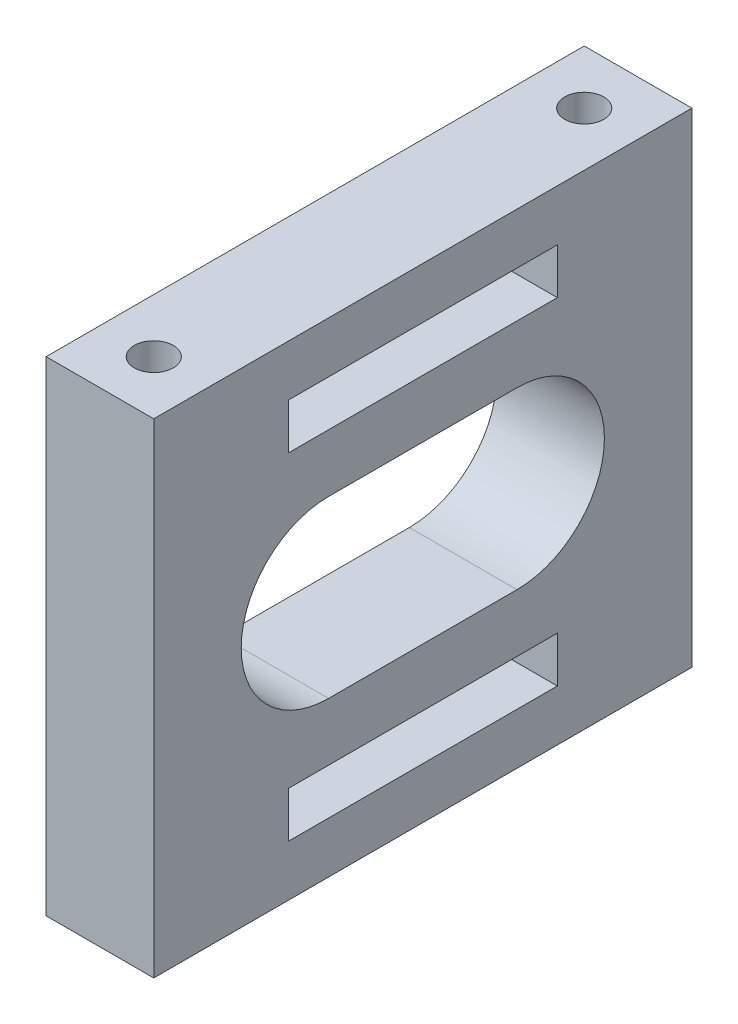
ISO-10303-21;
HEADER;
FILE_DESCRIPTION(('STEP AP214'),'2;1');
FILE_NAME('part.step','',(''),(''),'','','');
FILE_SCHEMA(('AUTOMOTIVE_DESIGN { 1 0 10303 214 1 1 1 1 }'));
ENDSEC;
DATA;
#1=APPLICATION_CONTEXT('core data for automotive mechanical design processes');
#2=APPLICATION_PROTOCOL_DEFINITION('international standard','automotive_design',2000,#1);
#3=PRODUCT_CONTEXT('',#1,'mechanical');
#4=PRODUCT('Part','Part','',(#3));
#5=PRODUCT_RELATED_PRODUCT_CATEGORY('part','',(#4));
#6=PRODUCT_DEFINITION_FORMATION('','',#4);
#7=PRODUCT_DEFINITION_CONTEXT('part definition',#1,'design');
#8=PRODUCT_DEFINITION('design','',#6,#7);
#9=PRODUCT_DEFINITION_SHAPE('','',#8);
#10=(LENGTH_UNIT() NAMED_UNIT(*) SI_UNIT(.MILLI.,.METRE.));
#11=(NAMED_UNIT(*) PLANE_ANGLE_UNIT() SI_UNIT($,.RADIAN.));
#12=(NAMED_UNIT(*) SI_UNIT($,.STERADIAN.) SOLID_ANGLE_UNIT());
#13=UNCERTAINTY_MEASURE_WITH_UNIT(LENGTH_MEASURE(1.E-05),#10,'distance_accuracy_value','');
#14=(GEOMETRIC_REPRESENTATION_CONTEXT(3) GLOBAL_UNCERTAINTY_ASSIGNED_CONTEXT((#13)) GLOBAL_UNIT_ASSIGNED_CONTEXT((#10,
#11,#12)) REPRESENTATION_CONTEXT('',''));
#15=CARTESIAN_POINT('',(0.,0.,0.));
#16=DIRECTION('',(0.,0.,1.));
#17=DIRECTION('',(1.,0.,0.));
#18=AXIS2_PLACEMENT_3D('',#15,#16,#17);
#19=CARTESIAN_POINT('',(8.,0.,0.));
#20=DIRECTION('',(1.,0.,0.));
#21=DIRECTION('',(0.,0.,-1.));
#22=AXIS2_PLACEMENT_3D('',#19,#20,#21);
#23=PLANE('',#22);
#24=DIRECTION('',(0.,-1.,0.));
#25=VECTOR('',#24,1.);
#26=CARTESIAN_POINT('',(8.,0.,0.));
#27=LINE('',#26,#25);
#28=CARTESIAN_POINT('',(8.,0.,0.));
#29=VERTEX_POINT('',#28);
#30=CARTESIAN_POINT('',(8.,-36.,0.));
#31=VERTEX_POINT('',#30);
#32=EDGE_CURVE('E288',#29,#31,#27,.T.);
#33=ORIENTED_EDGE('',*,*,#32,.T.);
#34=DIRECTION('',(0.,0.,-1.));
#35=VECTOR('',#34,1.);
#36=CARTESIAN_POINT('',(8.,-36.,0.));
#37=LINE('',#36,#35);
#38=CARTESIAN_POINT('',(8.,-36.,-40.));
#39=VERTEX_POINT('',#38);
#40=EDGE_CURVE('E291',#31,#39,#37,.T.);
#41=ORIENTED_EDGE('',*,*,#40,.T.);
#42=DIRECTION('',(0.,1.,0.));
#43=VECTOR('',#42,1.);
#44=CARTESIAN_POINT('',(8.,0.,-40.));
#45=LINE('',#44,#43);
#46=CARTESIAN_POINT('',(8.,0.,-40.));
#47=VERTEX_POINT('',#46);
#48=EDGE_CURVE('E294',#39,#47,#45,.T.);
#49=ORIENTED_EDGE('',*,*,#48,.T.);
#50=DIRECTION('',(0.,0.,1.));
#51=VECTOR('',#50,1.);
#52=CARTESIAN_POINT('',(8.,0.,0.));
#53=LINE('',#52,#51);
#54=EDGE_CURVE('E296',#47,#29,#53,.T.);
#55=ORIENTED_EDGE('',*,*,#54,.T.);
#56=EDGE_LOOP('',(#33,#41,#49,#55));
#57=FACE_BOUND('',#56,.T.);
#58=DIRECTION('',(0.,-1.,0.));
#59=VECTOR('',#58,1.);
#60=CARTESIAN_POINT('',(8.,-3.8,-10.));
#61=LINE('',#60,#59);
#62=CARTESIAN_POINT('',(8.,-3.8,-10.));
#63=VERTEX_POINT('',#62);
#64=CARTESIAN_POINT('',(8.,-7.2,-10.));
#65=VERTEX_POINT('',#64);
#66=EDGE_CURVE('E249',#63,#65,#61,.T.);
#67=ORIENTED_EDGE('',*,*,#66,.F.);
#68=DIRECTION('',(0.,0.,1.));
#69=VECTOR('',#68,1.);
#70=CARTESIAN_POINT('',(8.,-3.8,-10.));
#71=LINE('',#70,#69);
#72=CARTESIAN_POINT('',(8.,-3.8,-30.));
#73=VERTEX_POINT('',#72);
#74=EDGE_CURVE('E260',#73,#63,#71,.T.);
#75=ORIENTED_EDGE('',*,*,#74,.F.);
#76=DIRECTION('',(0.,1.,0.));
#77=VECTOR('',#76,1.);
#78=CARTESIAN_POINT('',(8.,-3.8,-30.));
#79=LINE('',#78,#77);
#80=CARTESIAN_POINT('',(8.,-7.2,-30.));
#81=VERTEX_POINT('',#80);
#82=EDGE_CURVE('E274',#81,#73,#79,.T.);
#83=ORIENTED_EDGE('',*,*,#82,.F.);
#84=DIRECTION('',(0.,0.,-1.));
#85=VECTOR('',#84,1.);
#86=CARTESIAN_POINT('',(8.,-7.2,-10.));
#87=LINE('',#86,#85);
#88=EDGE_CURVE('E271',#65,#81,#87,.T.);
#89=ORIENTED_EDGE('',*,*,#88,.F.);
#90=EDGE_LOOP('',(#67,#75,#83,#89));
#91=FACE_BOUND('',#90,.T.);
#92=DIRECTION('',(0.,-1.,0.));
#93=VECTOR('',#92,1.);
#94=CARTESIAN_POINT('',(8.,-28.8,-10.0000000000003));
#95=LINE('',#94,#93);
#96=CARTESIAN_POINT('',(8.,-28.8,-10.0000000000003));
#97=VERTEX_POINT('',#96);
#98=CARTESIAN_POINT('',(8.,-32.2,-10.0000000000003));
#99=VERTEX_POINT('',#98);
#100=EDGE_CURVE('E221',#97,#99,#95,.T.);
#101=ORIENTED_EDGE('',*,*,#100,.F.);
#102=DIRECTION('',(0.,0.,1.));
#103=VECTOR('',#102,1.);
#104=CARTESIAN_POINT('',(8.,-28.8,-10.0000000000003));
#105=LINE('',#104,#103);
#106=CARTESIAN_POINT('',(8.,-28.8,-30.0000000000003));
#107=VERTEX_POINT('',#106);
#108=EDGE_CURVE('E228',#107,#97,#105,.T.);
#109=ORIENTED_EDGE('',*,*,#108,.F.);
#110=DIRECTION('',(0.,1.,0.));
#111=VECTOR('',#110,1.);
#112=CARTESIAN_POINT('',(8.,-28.8,-30.0000000000003));
#113=LINE('',#112,#111);
#114=CARTESIAN_POINT('',(8.,-32.2,-30.0000000000003));
#115=VERTEX_POINT('',#114);
#116=EDGE_CURVE('E242',#115,#107,#113,.T.);
#117=ORIENTED_EDGE('',*,*,#116,.F.);
#118=DIRECTION('',(0.,0.,-1.));
#119=VECTOR('',#118,1.);
#120=CARTESIAN_POINT('',(8.,-32.2,-10.0000000000003));
#121=LINE('',#120,#119);
#122=EDGE_CURVE('E239',#99,#115,#121,.T.);
#123=ORIENTED_EDGE('',*,*,#122,.F.);
#124=EDGE_LOOP('',(#101,#109,#117,#123));
#125=FACE_BOUND('',#124,.T.);
#126=CARTESIAN_POINT('',(8.,-18.,-13.));
#127=DIRECTION('',(1.,0.,0.));
#128=DIRECTION('',(0.,0.,-1.));
#129=AXIS2_PLACEMENT_3D('',#126,#127,#128);
#130=CIRCLE('',#129,6.5);
#131=CARTESIAN_POINT('',(8.,-11.5,-13.));
#132=VERTEX_POINT('',#131);
#133=CARTESIAN_POINT('',(8.,-24.5,-13.));
#134=VERTEX_POINT('',#133);
#135=EDGE_CURVE('E78',#132,#134,#130,.T.);
#136=ORIENTED_EDGE('',*,*,#135,.F.);
#137=DIRECTION('',(0.,0.,-1.));
#138=VECTOR('',#137,1.);
#139=CARTESIAN_POINT('',(8.,-11.5,-13.));
#140=LINE('',#139,#138);
#141=CARTESIAN_POINT('',(8.,-11.5,-27.));
#142=VERTEX_POINT('',#141);
#143=EDGE_CURVE('E186',#132,#142,#140,.T.);
#144=ORIENTED_EDGE('',*,*,#143,.T.);
#145=CARTESIAN_POINT('',(8.,-18.,-27.));
#146=DIRECTION('',(1.,0.,0.));
#147=DIRECTION('',(0.,0.,-1.));
#148=AXIS2_PLACEMENT_3D('',#145,#146,#147);
#149=CIRCLE('',#148,6.5);
#150=CARTESIAN_POINT('',(8.,-24.5,-27.));
#151=VERTEX_POINT('',#150);
#152=EDGE_CURVE('E210',#151,#142,#149,.T.);
#153=ORIENTED_EDGE('',*,*,#152,.F.);
#154=DIRECTION('',(0.,0.,-1.));
#155=VECTOR('',#154,1.);
#156=CARTESIAN_POINT('',(8.,-24.5,-13.));
#157=LINE('',#156,#155);
#158=EDGE_CURVE('E192',#134,#151,#157,.T.);
#159=ORIENTED_EDGE('',*,*,#158,.F.);
#160=EDGE_LOOP('',(#136,#144,#153,#159));
#161=FACE_BOUND('',#160,.T.);
#162=ADVANCED_FACE('F63',(#57,#91,#125,#161),#23,.T.);
#163=CARTESIAN_POINT('',(0.,0.,0.));
#164=DIRECTION('',(1.,0.,0.));
#165=DIRECTION('',(0.,0.,-1.));
#166=AXIS2_PLACEMENT_3D('',#163,#164,#165);
#167=PLANE('',#166);
#168=DIRECTION('',(0.,-1.,0.));
#169=VECTOR('',#168,1.);
#170=CARTESIAN_POINT('',(0.,0.,0.));
#171=LINE('',#170,#169);
#172=CARTESIAN_POINT('',(0.,0.,0.));
#173=VERTEX_POINT('',#172);
#174=CARTESIAN_POINT('',(0.,-36.,0.));
#175=VERTEX_POINT('',#174);
#176=EDGE_CURVE('E281',#173,#175,#171,.T.);
#177=ORIENTED_EDGE('',*,*,#176,.F.);
#178=DIRECTION('',(0.,0.,1.));
#179=VECTOR('',#178,1.);
#180=CARTESIAN_POINT('',(0.,0.,0.));
#181=LINE('',#180,#179);
#182=CARTESIAN_POINT('',(0.,0.,-40.));
#183=VERTEX_POINT('',#182);
#184=EDGE_CURVE('E292',#183,#173,#181,.T.);
#185=ORIENTED_EDGE('',*,*,#184,.F.);
#186=DIRECTION('',(0.,1.,0.));
#187=VECTOR('',#186,1.);
#188=CARTESIAN_POINT('',(0.,0.,-40.));
#189=LINE('',#188,#187);
#190=CARTESIAN_POINT('',(0.,-36.,-40.));
#191=VERTEX_POINT('',#190);
#192=EDGE_CURVE('E303',#191,#183,#189,.T.);
#193=ORIENTED_EDGE('',*,*,#192,.F.);
#194=DIRECTION('',(0.,0.,-1.));
#195=VECTOR('',#194,1.);
#196=CARTESIAN_POINT('',(0.,-36.,0.));
#197=LINE('',#196,#195);
#198=EDGE_CURVE('E301',#175,#191,#197,.T.);
#199=ORIENTED_EDGE('',*,*,#198,.F.);
#200=EDGE_LOOP('',(#177,#185,#193,#199));
#201=FACE_BOUND('',#200,.T.);
#202=DIRECTION('',(0.,0.,1.));
#203=VECTOR('',#202,1.);
#204=CARTESIAN_POINT('',(0.,-3.8,-10.));
#205=LINE('',#204,#203);
#206=CARTESIAN_POINT('',(0.,-3.8,-30.));
#207=VERTEX_POINT('',#206);
#208=CARTESIAN_POINT('',(0.,-3.8,-10.));
#209=VERTEX_POINT('',#208);
#210=EDGE_CURVE('E266',#207,#209,#205,.T.);
#211=ORIENTED_EDGE('',*,*,#210,.T.);
#212=DIRECTION('',(0.,-1.,0.));
#213=VECTOR('',#212,1.);
#214=CARTESIAN_POINT('',(0.,-3.8,-10.));
#215=LINE('',#214,#213);
#216=CARTESIAN_POINT('',(0.,-7.2,-10.));
#217=VERTEX_POINT('',#216);
#218=EDGE_CURVE('E256',#209,#217,#215,.T.);
#219=ORIENTED_EDGE('',*,*,#218,.T.);
#220=DIRECTION('',(0.,0.,-1.));
#221=VECTOR('',#220,1.);
#222=CARTESIAN_POINT('',(0.,-7.2,-10.));
#223=LINE('',#222,#221);
#224=CARTESIAN_POINT('',(0.,-7.2,-30.));
#225=VERTEX_POINT('',#224);
#226=EDGE_CURVE('E259',#217,#225,#223,.T.);
#227=ORIENTED_EDGE('',*,*,#226,.T.);
#228=DIRECTION('',(0.,1.,0.));
#229=VECTOR('',#228,1.);
#230=CARTESIAN_POINT('',(0.,-3.8,-30.));
#231=LINE('',#230,#229);
#232=EDGE_CURVE('E263',#225,#207,#231,.T.);
#233=ORIENTED_EDGE('',*,*,#232,.T.);
#234=EDGE_LOOP('',(#211,#219,#227,#233));
#235=FACE_BOUND('',#234,.T.);
#236=DIRECTION('',(0.,0.,1.));
#237=VECTOR('',#236,1.);
#238=CARTESIAN_POINT('',(0.,-28.8,-10.0000000000003));
#239=LINE('',#238,#237);
#240=CARTESIAN_POINT('',(0.,-28.8,-30.0000000000003));
#241=VERTEX_POINT('',#240);
#242=CARTESIAN_POINT('',(0.,-28.8,-10.0000000000003));
#243=VERTEX_POINT('',#242);
#244=EDGE_CURVE('E234',#241,#243,#239,.T.);
#245=ORIENTED_EDGE('',*,*,#244,.T.);
#246=DIRECTION('',(0.,-1.,0.));
#247=VECTOR('',#246,1.);
#248=CARTESIAN_POINT('',(0.,-28.8,-10.0000000000003));
#249=LINE('',#248,#247);
#250=CARTESIAN_POINT('',(0.,-32.2,-10.0000000000003));
#251=VERTEX_POINT('',#250);
#252=EDGE_CURVE('E224',#243,#251,#249,.T.);
#253=ORIENTED_EDGE('',*,*,#252,.T.);
#254=DIRECTION('',(0.,0.,-1.));
#255=VECTOR('',#254,1.);
#256=CARTESIAN_POINT('',(0.,-32.2,-10.0000000000003));
#257=LINE('',#256,#255);
#258=CARTESIAN_POINT('',(0.,-32.2,-30.0000000000003));
#259=VERTEX_POINT('',#258);
#260=EDGE_CURVE('E227',#251,#259,#257,.T.);
#261=ORIENTED_EDGE('',*,*,#260,.T.);
#262=DIRECTION('',(0.,1.,0.));
#263=VECTOR('',#262,1.);
#264=CARTESIAN_POINT('',(0.,-28.8,-30.0000000000003));
#265=LINE('',#264,#263);
#266=EDGE_CURVE('E231',#259,#241,#265,.T.);
#267=ORIENTED_EDGE('',*,*,#266,.T.);
#268=EDGE_LOOP('',(#245,#253,#261,#267));
#269=FACE_BOUND('',#268,.T.);
#270=DIRECTION('',(0.,0.,-1.));
#271=VECTOR('',#270,1.);
#272=CARTESIAN_POINT('',(0.,-11.5,-13.));
#273=LINE('',#272,#271);
#274=CARTESIAN_POINT('',(0.,-11.5,-13.));
#275=VERTEX_POINT('',#274);
#276=CARTESIAN_POINT('',(0.,-11.5,-27.));
#277=VERTEX_POINT('',#276);
#278=EDGE_CURVE('E202',#275,#277,#273,.T.);
#279=ORIENTED_EDGE('',*,*,#278,.F.);
#280=CARTESIAN_POINT('',(0.,-18.,-13.));
#281=DIRECTION('',(1.,0.,0.));
#282=DIRECTION('',(0.,0.,-1.));
#283=AXIS2_PLACEMENT_3D('',#280,#281,#282);
#284=CIRCLE('',#283,6.5);
#285=CARTESIAN_POINT('',(0.,-24.5,-13.));
#286=VERTEX_POINT('',#285);
#287=EDGE_CURVE('E178',#275,#286,#284,.T.);
#288=ORIENTED_EDGE('',*,*,#287,.T.);
#289=DIRECTION('',(0.,0.,-1.));
#290=VECTOR('',#289,1.);
#291=CARTESIAN_POINT('',(0.,-24.5,-13.));
#292=LINE('',#291,#290);
#293=CARTESIAN_POINT('',(0.,-24.5,-27.));
#294=VERTEX_POINT('',#293);
#295=EDGE_CURVE('E204',#286,#294,#292,.T.);
#296=ORIENTED_EDGE('',*,*,#295,.T.);
#297=CARTESIAN_POINT('',(0.,-18.,-27.));
#298=DIRECTION('',(1.,0.,0.));
#299=DIRECTION('',(0.,0.,-1.));
#300=AXIS2_PLACEMENT_3D('',#297,#298,#299);
#301=CIRCLE('',#300,6.5);
#302=EDGE_CURVE('E86',#294,#277,#301,.T.);
#303=ORIENTED_EDGE('',*,*,#302,.T.);
#304=EDGE_LOOP('',(#279,#288,#296,#303));
#305=FACE_BOUND('',#304,.T.);
#306=ADVANCED_FACE('F321',(#201,#235,#269,#305),#167,.F.);
#307=CARTESIAN_POINT('',(8.,0.,0.));
#308=DIRECTION('',(0.,0.,-1.));
#309=DIRECTION('',(0.,1.,0.));
#310=AXIS2_PLACEMENT_3D('',#307,#308,#309);
#311=PLANE('',#310);
#312=ORIENTED_EDGE('',*,*,#176,.T.);
#313=DIRECTION('',(-1.,0.,0.));
#314=VECTOR('',#313,1.);
#315=CARTESIAN_POINT('',(8.,-36.,0.));
#316=LINE('',#315,#314);
#317=EDGE_CURVE('E12',#31,#175,#316,.T.);
#318=ORIENTED_EDGE('',*,*,#317,.F.);
#319=ORIENTED_EDGE('',*,*,#32,.F.);
#320=DIRECTION('',(-1.,0.,0.));
#321=VECTOR('',#320,1.);
#322=CARTESIAN_POINT('',(8.,0.,0.));
#323=LINE('',#322,#321);
#324=EDGE_CURVE('E298',#29,#173,#323,.T.);
#325=ORIENTED_EDGE('',*,*,#324,.T.);
#326=EDGE_LOOP('',(#312,#318,#319,#325));
#327=FACE_BOUND('',#326,.T.);
#328=ADVANCED_FACE('F65',(#327),#311,.F.);
#329=CARTESIAN_POINT('',(8.,-36.,0.));
#330=DIRECTION('',(0.,1.,0.));
#331=DIRECTION('',(0.,0.,1.));
#332=AXIS2_PLACEMENT_3D('',#329,#330,#331);
#333=PLANE('',#332);
#334=CARTESIAN_POINT('',(3.99999999999989,-36.,-36.));
#335=DIRECTION('',(0.,1.,0.));
#336=DIRECTION('',(0.,0.,1.));
#337=AXIS2_PLACEMENT_3D('',#334,#335,#336);
#338=CIRCLE('',#337,1.45);
#339=CARTESIAN_POINT('',(3.99999999999989,-36.,-34.55));
#340=VERTEX_POINT('',#339);
#341=EDGE_CURVE('E212',#340,#340,#338,.T.);
#342=ORIENTED_EDGE('',*,*,#341,.T.);
#343=EDGE_LOOP('',(#342));
#344=FACE_BOUND('',#343,.T.);
#345=CARTESIAN_POINT('',(4.,-36.,-4.));
#346=DIRECTION('',(0.,1.,0.));
#347=DIRECTION('',(0.,0.,1.));
#348=AXIS2_PLACEMENT_3D('',#345,#346,#347);
#349=CIRCLE('',#348,1.45);
#350=CARTESIAN_POINT('',(4.,-36.,-2.55));
#351=VERTEX_POINT('',#350);
#352=EDGE_CURVE('E218',#351,#351,#349,.T.);
#353=ORIENTED_EDGE('',*,*,#352,.T.);
#354=EDGE_LOOP('',(#353));
#355=FACE_BOUND('',#354,.T.);
#356=ORIENTED_EDGE('',*,*,#198,.T.);
#357=DIRECTION('',(-1.,0.,0.));
#358=VECTOR('',#357,1.);
#359=CARTESIAN_POINT('',(8.,-36.,-40.));
#360=LINE('',#359,#358);
#361=EDGE_CURVE('E71',#39,#191,#360,.T.);
#362=ORIENTED_EDGE('',*,*,#361,.F.);
#363=ORIENTED_EDGE('',*,*,#40,.F.);
#364=ORIENTED_EDGE('',*,*,#317,.T.);
#365=EDGE_LOOP('',(#356,#362,#363,#364));
#366=FACE_BOUND('',#365,.T.);
#367=ADVANCED_FACE('F332',(#344,#355,#366),#333,.F.);
#368=CARTESIAN_POINT('',(8.,0.,-40.));
#369=DIRECTION('',(0.,0.,1.));
#370=DIRECTION('',(0.,-1.,0.));
#371=AXIS2_PLACEMENT_3D('',#368,#369,#370);
#372=PLANE('',#371);
#373=ORIENTED_EDGE('',*,*,#192,.T.);
#374=DIRECTION('',(-1.,0.,0.));
#375=VECTOR('',#374,1.);
#376=CARTESIAN_POINT('',(8.,0.,-40.));
#377=LINE('',#376,#375);
#378=EDGE_CURVE('E308',#47,#183,#377,.T.);
#379=ORIENTED_EDGE('',*,*,#378,.F.);
#380=ORIENTED_EDGE('',*,*,#48,.F.);
#381=ORIENTED_EDGE('',*,*,#361,.T.);
#382=EDGE_LOOP('',(#373,#379,#380,#381));
#383=FACE_BOUND('',#382,.T.);
#384=ADVANCED_FACE('F315',(#383),#372,.F.);
#385=CARTESIAN_POINT('',(8.,0.,0.));
#386=DIRECTION('',(0.,-1.,0.));
#387=DIRECTION('',(0.,0.,-1.));
#388=AXIS2_PLACEMENT_3D('',#385,#386,#387);
#389=PLANE('',#388);
#390=CARTESIAN_POINT('',(3.99999999999989,0.,-36.));
#391=DIRECTION('',(0.,1.,0.));
#392=DIRECTION('',(0.,0.,1.));
#393=AXIS2_PLACEMENT_3D('',#390,#391,#392);
#394=CIRCLE('',#393,1.45);
#395=CARTESIAN_POINT('',(3.99999999999989,0.,-34.55));
#396=VERTEX_POINT('',#395);
#397=EDGE_CURVE('E182',#396,#396,#394,.T.);
#398=ORIENTED_EDGE('',*,*,#397,.F.);
#399=EDGE_LOOP('',(#398));
#400=FACE_BOUND('',#399,.T.);
#401=CARTESIAN_POINT('',(4.,0.,-4.));
#402=DIRECTION('',(0.,1.,0.));
#403=DIRECTION('',(0.,0.,1.));
#404=AXIS2_PLACEMENT_3D('',#401,#402,#403);
#405=CIRCLE('',#404,1.45);
#406=CARTESIAN_POINT('',(4.,0.,-2.55));
#407=VERTEX_POINT('',#406);
#408=EDGE_CURVE('E215',#407,#407,#405,.T.);
#409=ORIENTED_EDGE('',*,*,#408,.F.);
#410=EDGE_LOOP('',(#409));
#411=FACE_BOUND('',#410,.T.);
#412=ORIENTED_EDGE('',*,*,#184,.T.);
#413=ORIENTED_EDGE('',*,*,#324,.F.);
#414=ORIENTED_EDGE('',*,*,#54,.F.);
#415=ORIENTED_EDGE('',*,*,#378,.T.);
#416=EDGE_LOOP('',(#412,#413,#414,#415));
#417=FACE_BOUND('',#416,.T.);
#418=ADVANCED_FACE('F325',(#400,#411,#417),#389,.F.);
#419=CARTESIAN_POINT('',(0.,-3.8,-10.));
#420=DIRECTION('',(0.,0.,1.));
#421=DIRECTION('',(1.,0.,0.));
#422=AXIS2_PLACEMENT_3D('',#419,#420,#421);
#423=PLANE('',#422);
#424=ORIENTED_EDGE('',*,*,#66,.T.);
#425=DIRECTION('',(1.,0.,0.));
#426=VECTOR('',#425,1.);
#427=CARTESIAN_POINT('',(0.,-7.2,-10.));
#428=LINE('',#427,#426);
#429=EDGE_CURVE('E269',#217,#65,#428,.T.);
#430=ORIENTED_EDGE('',*,*,#429,.F.);
#431=ORIENTED_EDGE('',*,*,#218,.F.);
#432=DIRECTION('',(1.,0.,0.));
#433=VECTOR('',#432,1.);
#434=CARTESIAN_POINT('',(0.,-3.8,-10.));
#435=LINE('',#434,#433);
#436=EDGE_CURVE('E279',#209,#63,#435,.T.);
#437=ORIENTED_EDGE('',*,*,#436,.T.);
#438=EDGE_LOOP('',(#424,#430,#431,#437));
#439=FACE_BOUND('',#438,.T.);
#440=ADVANCED_FACE('F348',(#439),#423,.F.);
#441=CARTESIAN_POINT('',(0.,-3.8,-10.));
#442=DIRECTION('',(0.,1.,0.));
#443=DIRECTION('',(0.,0.,1.));
#444=AXIS2_PLACEMENT_3D('',#441,#442,#443);
#445=PLANE('',#444);
#446=ORIENTED_EDGE('',*,*,#74,.T.);
#447=ORIENTED_EDGE('',*,*,#436,.F.);
#448=ORIENTED_EDGE('',*,*,#210,.F.);
#449=DIRECTION('',(1.,0.,0.));
#450=VECTOR('',#449,1.);
#451=CARTESIAN_POINT('',(0.,-3.8,-30.));
#452=LINE('',#451,#450);
#453=EDGE_CURVE('E282',#207,#73,#452,.T.);
#454=ORIENTED_EDGE('',*,*,#453,.T.);
#455=EDGE_LOOP('',(#446,#447,#448,#454));
#456=FACE_BOUND('',#455,.T.);
#457=ADVANCED_FACE('F356',(#456),#445,.F.);
#458=CARTESIAN_POINT('',(0.,-3.8,-30.));
#459=DIRECTION('',(0.,0.,-1.));
#460=DIRECTION('',(-1.,0.,0.));
#461=AXIS2_PLACEMENT_3D('',#458,#459,#460);
#462=PLANE('',#461);
#463=ORIENTED_EDGE('',*,*,#82,.T.);
#464=ORIENTED_EDGE('',*,*,#453,.F.);
#465=ORIENTED_EDGE('',*,*,#232,.F.);
#466=DIRECTION('',(1.,0.,0.));
#467=VECTOR('',#466,1.);
#468=CARTESIAN_POINT('',(0.,-7.2,-30.));
#469=LINE('',#468,#467);
#470=EDGE_CURVE('E284',#225,#81,#469,.T.);
#471=ORIENTED_EDGE('',*,*,#470,.T.);
#472=EDGE_LOOP('',(#463,#464,#465,#471));
#473=FACE_BOUND('',#472,.T.);
#474=ADVANCED_FACE('F394',(#473),#462,.F.);
#475=CARTESIAN_POINT('',(0.,-7.2,-10.));
#476=DIRECTION('',(0.,-1.,0.));
#477=DIRECTION('',(0.,0.,-1.));
#478=AXIS2_PLACEMENT_3D('',#475,#476,#477);
#479=PLANE('',#478);
#480=ORIENTED_EDGE('',*,*,#88,.T.);
#481=ORIENTED_EDGE('',*,*,#470,.F.);
#482=ORIENTED_EDGE('',*,*,#226,.F.);
#483=ORIENTED_EDGE('',*,*,#429,.T.);
#484=EDGE_LOOP('',(#480,#481,#482,#483));
#485=FACE_BOUND('',#484,.T.);
#486=ADVANCED_FACE('F390',(#485),#479,.F.);
#487=CARTESIAN_POINT('',(0.,-28.8,-10.0000000000003));
#488=DIRECTION('',(0.,0.,1.));
#489=DIRECTION('',(1.,0.,0.));
#490=AXIS2_PLACEMENT_3D('',#487,#488,#489);
#491=PLANE('',#490);
#492=ORIENTED_EDGE('',*,*,#100,.T.);
#493=DIRECTION('',(1.,0.,0.));
#494=VECTOR('',#493,1.);
#495=CARTESIAN_POINT('',(0.,-32.2,-10.0000000000003));
#496=LINE('',#495,#494);
#497=EDGE_CURVE('E237',#251,#99,#496,.T.);
#498=ORIENTED_EDGE('',*,*,#497,.F.);
#499=ORIENTED_EDGE('',*,*,#252,.F.);
#500=DIRECTION('',(1.,0.,0.));
#501=VECTOR('',#500,1.);
#502=CARTESIAN_POINT('',(0.,-28.8,-10.0000000000003));
#503=LINE('',#502,#501);
#504=EDGE_CURVE('E247',#243,#97,#503,.T.);
#505=ORIENTED_EDGE('',*,*,#504,.T.);
#506=EDGE_LOOP('',(#492,#498,#499,#505));
#507=FACE_BOUND('',#506,.T.);
#508=ADVANCED_FACE('F383',(#507),#491,.F.);
#509=CARTESIAN_POINT('',(0.,-28.8,-10.0000000000003));
#510=DIRECTION('',(0.,1.,0.));
#511=DIRECTION('',(0.,0.,1.));
#512=AXIS2_PLACEMENT_3D('',#509,#510,#511);
#513=PLANE('',#512);
#514=ORIENTED_EDGE('',*,*,#108,.T.);
#515=ORIENTED_EDGE('',*,*,#504,.F.);
#516=ORIENTED_EDGE('',*,*,#244,.F.);
#517=DIRECTION('',(1.,0.,0.));
#518=VECTOR('',#517,1.);
#519=CARTESIAN_POINT('',(0.,-28.8,-30.0000000000003));
#520=LINE('',#519,#518);
#521=EDGE_CURVE('E250',#241,#107,#520,.T.);
#522=ORIENTED_EDGE('',*,*,#521,.T.);
#523=EDGE_LOOP('',(#514,#515,#516,#522));
#524=FACE_BOUND('',#523,.T.);
#525=ADVANCED_FACE('F380',(#524),#513,.F.);
#526=CARTESIAN_POINT('',(0.,-28.8,-30.0000000000003));
#527=DIRECTION('',(0.,0.,-1.));
#528=DIRECTION('',(-1.,0.,0.));
#529=AXIS2_PLACEMENT_3D('',#526,#527,#528);
#530=PLANE('',#529);
#531=ORIENTED_EDGE('',*,*,#116,.T.);
#532=ORIENTED_EDGE('',*,*,#521,.F.);
#533=ORIENTED_EDGE('',*,*,#266,.F.);
#534=DIRECTION('',(1.,0.,0.));
#535=VECTOR('',#534,1.);
#536=CARTESIAN_POINT('',(0.,-32.2,-30.0000000000003));
#537=LINE('',#536,#535);
#538=EDGE_CURVE('E252',#259,#115,#537,.T.);
#539=ORIENTED_EDGE('',*,*,#538,.T.);
#540=EDGE_LOOP('',(#531,#532,#533,#539));
#541=FACE_BOUND('',#540,.T.);
#542=ADVANCED_FACE('F374',(#541),#530,.F.);
#543=CARTESIAN_POINT('',(0.,-32.2,-10.0000000000003));
#544=DIRECTION('',(0.,-1.,0.));
#545=DIRECTION('',(0.,0.,-1.));
#546=AXIS2_PLACEMENT_3D('',#543,#544,#545);
#547=PLANE('',#546);
#548=ORIENTED_EDGE('',*,*,#122,.T.);
#549=ORIENTED_EDGE('',*,*,#538,.F.);
#550=ORIENTED_EDGE('',*,*,#260,.F.);
#551=ORIENTED_EDGE('',*,*,#497,.T.);
#552=EDGE_LOOP('',(#548,#549,#550,#551));
#553=FACE_BOUND('',#552,.T.);
#554=ADVANCED_FACE('F365',(#553),#547,.F.);
#555=CARTESIAN_POINT('',(4.,-36.,-4.));
#556=DIRECTION('',(0.,1.,0.));
#557=DIRECTION('',(0.,0.,1.));
#558=AXIS2_PLACEMENT_3D('',#555,#556,#557);
#559=CYLINDRICAL_SURFACE('',#558,1.45);
#560=ORIENTED_EDGE('',*,*,#352,.F.);
#561=EDGE_LOOP('',(#560));
#562=FACE_BOUND('',#561,.T.);
#563=ORIENTED_EDGE('',*,*,#408,.T.);
#564=EDGE_LOOP('',(#563));
#565=FACE_BOUND('',#564,.T.);
#566=ADVANCED_FACE('F362',(#562,#565),#559,.F.);
#567=CARTESIAN_POINT('',(3.99999999999989,-36.,-36.));
#568=DIRECTION('',(0.,1.,0.));
#569=DIRECTION('',(0.,0.,1.));
#570=AXIS2_PLACEMENT_3D('',#567,#568,#569);
#571=CYLINDRICAL_SURFACE('',#570,1.45);
#572=ORIENTED_EDGE('',*,*,#341,.F.);
#573=EDGE_LOOP('',(#572));
#574=FACE_BOUND('',#573,.T.);
#575=ORIENTED_EDGE('',*,*,#397,.T.);
#576=EDGE_LOOP('',(#575));
#577=FACE_BOUND('',#576,.T.);
#578=ADVANCED_FACE('F364',(#574,#577),#571,.F.);
#579=CARTESIAN_POINT('',(0.,-18.,-13.));
#580=DIRECTION('',(1.,0.,0.));
#581=DIRECTION('',(0.,0.,-1.));
#582=AXIS2_PLACEMENT_3D('',#579,#580,#581);
#583=CYLINDRICAL_SURFACE('',#582,6.5);
#584=ORIENTED_EDGE('',*,*,#135,.T.);
#585=DIRECTION('',(1.,0.,0.));
#586=VECTOR('',#585,1.);
#587=CARTESIAN_POINT('',(0.,-24.5,-13.));
#588=LINE('',#587,#586);
#589=EDGE_CURVE('E183',#134,#286,#588,.F.);
#590=ORIENTED_EDGE('',*,*,#589,.T.);
#591=ORIENTED_EDGE('',*,*,#287,.F.);
#592=DIRECTION('',(1.,0.,0.));
#593=VECTOR('',#592,1.);
#594=CARTESIAN_POINT('',(0.,-11.5,-13.));
#595=LINE('',#594,#593);
#596=EDGE_CURVE('E174',#132,#275,#595,.F.);
#597=ORIENTED_EDGE('',*,*,#596,.F.);
#598=EDGE_LOOP('',(#584,#590,#591,#597));
#599=FACE_BOUND('',#598,.T.);
#600=ADVANCED_FACE('F176',(#599),#583,.F.);
#601=CARTESIAN_POINT('',(0.,-18.,-27.));
#602=DIRECTION('',(1.,0.,0.));
#603=DIRECTION('',(0.,0.,-1.));
#604=AXIS2_PLACEMENT_3D('',#601,#602,#603);
#605=CYLINDRICAL_SURFACE('',#604,6.5);
#606=ORIENTED_EDGE('',*,*,#302,.F.);
#607=DIRECTION('',(1.,0.,0.));
#608=VECTOR('',#607,1.);
#609=CARTESIAN_POINT('',(0.,-24.5,-27.));
#610=LINE('',#609,#608);
#611=EDGE_CURVE('E198',#294,#151,#610,.T.);
#612=ORIENTED_EDGE('',*,*,#611,.T.);
#613=ORIENTED_EDGE('',*,*,#152,.T.);
#614=DIRECTION('',(1.,0.,0.));
#615=VECTOR('',#614,1.);
#616=CARTESIAN_POINT('',(0.,-11.5,-27.));
#617=LINE('',#616,#615);
#618=EDGE_CURVE('E188',#277,#142,#617,.T.);
#619=ORIENTED_EDGE('',*,*,#618,.F.);
#620=EDGE_LOOP('',(#606,#612,#613,#619));
#621=FACE_BOUND('',#620,.T.);
#622=ADVANCED_FACE('F417',(#621),#605,.F.);
#623=CARTESIAN_POINT('',(0.,-11.5,-13.));
#624=DIRECTION('',(0.,-1.,0.));
#625=DIRECTION('',(0.,0.,-1.));
#626=AXIS2_PLACEMENT_3D('',#623,#624,#625);
#627=PLANE('',#626);
#628=ORIENTED_EDGE('',*,*,#143,.F.);
#629=ORIENTED_EDGE('',*,*,#596,.T.);
#630=ORIENTED_EDGE('',*,*,#278,.T.);
#631=ORIENTED_EDGE('',*,*,#618,.T.);
#632=EDGE_LOOP('',(#628,#629,#630,#631));
#633=FACE_BOUND('',#632,.T.);
#634=ADVANCED_FACE('F187',(#633),#627,.T.);
#635=CARTESIAN_POINT('',(0.,-24.5,-13.));
#636=DIRECTION('',(0.,-1.,0.));
#637=DIRECTION('',(0.,0.,-1.));
#638=AXIS2_PLACEMENT_3D('',#635,#636,#637);
#639=PLANE('',#638);
#640=ORIENTED_EDGE('',*,*,#158,.T.);
#641=ORIENTED_EDGE('',*,*,#611,.F.);
#642=ORIENTED_EDGE('',*,*,#295,.F.);
#643=ORIENTED_EDGE('',*,*,#589,.F.);
#644=EDGE_LOOP('',(#640,#641,#642,#643));
#645=FACE_BOUND('',#644,.T.);
#646=ADVANCED_FACE('F416',(#645),#639,.F.);
#647=CLOSED_SHELL('',(#162,#306,#328,#367,#384,#418,#440,#457,#474,#486,#508,#525,#542,#554,
#566,#578,#600,#622,#634,#646));
#648=MANIFOLD_SOLID_BREP('B2',#647);
#649=ADVANCED_BREP_SHAPE_REPRESENTATION('',(#18,#648),#14);
#650=SHAPE_DEFINITION_REPRESENTATION(#9,#649);
ENDSEC;
END-ISO-10303-21;
